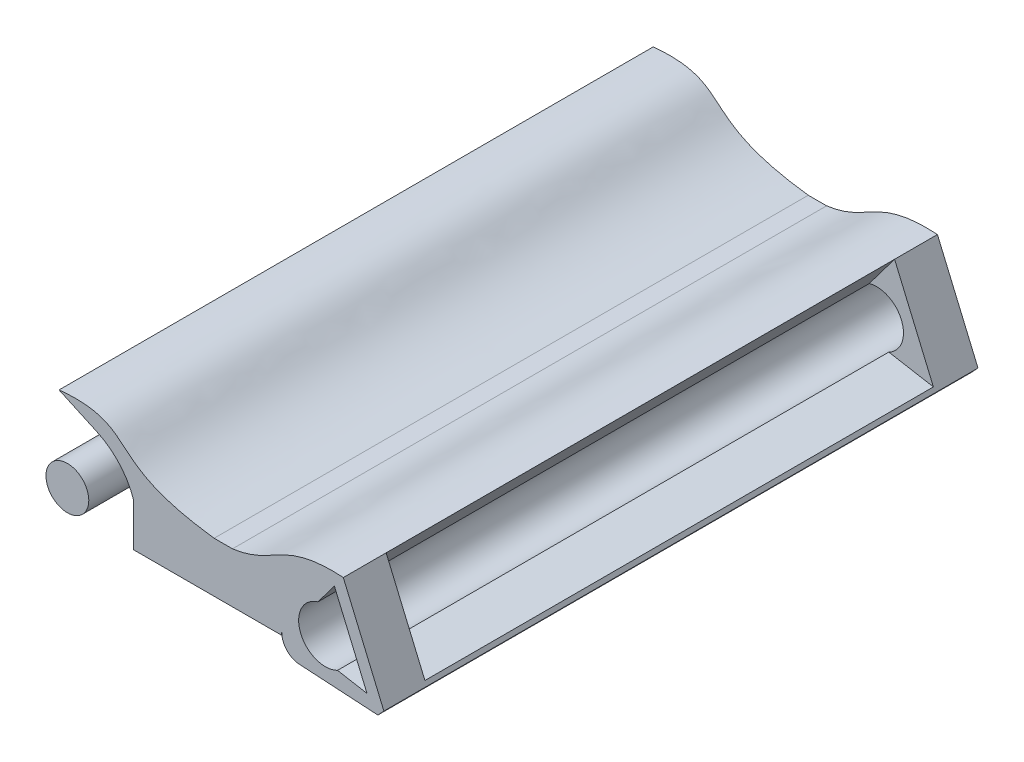
ISO-10303-21;
HEADER;
FILE_DESCRIPTION(('STEP AP214'),'2;1');
FILE_NAME('part.step','',(''),(''),'','','');
FILE_SCHEMA(('AUTOMOTIVE_DESIGN { 1 0 10303 214 1 1 1 1 }'));
ENDSEC;
DATA;
#1=APPLICATION_CONTEXT('core data for automotive mechanical design processes');
#2=APPLICATION_PROTOCOL_DEFINITION('international standard','automotive_design',2000,#1);
#3=PRODUCT_CONTEXT('',#1,'mechanical');
#4=PRODUCT('Part','Part','',(#3));
#5=PRODUCT_RELATED_PRODUCT_CATEGORY('part','',(#4));
#6=PRODUCT_DEFINITION_FORMATION('','',#4);
#7=PRODUCT_DEFINITION_CONTEXT('part definition',#1,'design');
#8=PRODUCT_DEFINITION('design','',#6,#7);
#9=PRODUCT_DEFINITION_SHAPE('','',#8);
#10=(LENGTH_UNIT() NAMED_UNIT(*) SI_UNIT(.MILLI.,.METRE.));
#11=(NAMED_UNIT(*) PLANE_ANGLE_UNIT() SI_UNIT($,.RADIAN.));
#12=(NAMED_UNIT(*) SI_UNIT($,.STERADIAN.) SOLID_ANGLE_UNIT());
#13=UNCERTAINTY_MEASURE_WITH_UNIT(LENGTH_MEASURE(1.E-05),#10,'distance_accuracy_value','');
#14=(GEOMETRIC_REPRESENTATION_CONTEXT(3) GLOBAL_UNCERTAINTY_ASSIGNED_CONTEXT((#13)) GLOBAL_UNIT_ASSIGNED_CONTEXT((#10,
#11,#12)) REPRESENTATION_CONTEXT('',''));
#15=CARTESIAN_POINT('',(0.,0.,0.));
#16=DIRECTION('',(0.,0.,1.));
#17=DIRECTION('',(1.,0.,0.));
#18=AXIS2_PLACEMENT_3D('',#15,#16,#17);
#19=CARTESIAN_POINT('',(0.,2.,49.89));
#20=DIRECTION('',(0.,1.,0.));
#21=DIRECTION('',(0.,0.,1.));
#22=AXIS2_PLACEMENT_3D('',#19,#20,#21);
#23=PLANE('',#22);
#24=DIRECTION('',(-1.,0.,0.));
#25=VECTOR('',#24,1.);
#26=CARTESIAN_POINT('',(0.,2.,49.99));
#27=LINE('',#26,#25);
#28=CARTESIAN_POINT('',(6.09107436430707,1.99992523995453,49.99));
#29=VERTEX_POINT('',#28);
#30=CARTESIAN_POINT('',(0.,2.,49.99));
#31=VERTEX_POINT('',#30);
#32=EDGE_CURVE('E264',#29,#31,#27,.T.);
#33=ORIENTED_EDGE('',*,*,#32,.F.);
#34=CARTESIAN_POINT('',(6.0910498178161,2.,49.99));
#35=DIRECTION('',(0.,0.,-1.));
#36=VECTOR('',#35,1.);
#37=LINE('',#34,#36);
#38=CARTESIAN_POINT('',(6.09130206674588,2.,49.89));
#39=VERTEX_POINT('',#38);
#40=EDGE_CURVE('E466',#29,#39,#37,.T.);
#41=ORIENTED_EDGE('',*,*,#40,.T.);
#42=CARTESIAN_POINT('',(6.09109891079803,1.99985047990906,5.50000000000001));
#43=DIRECTION('',(0.,0.,1.));
#44=VECTOR('',#43,1.);
#45=LINE('',#42,#44);
#46=CARTESIAN_POINT('',(6.09107436430707,1.99992523995453,5.50000000000001));
#47=VERTEX_POINT('',#46);
#48=EDGE_CURVE('E363',#47,#39,#45,.T.);
#49=ORIENTED_EDGE('',*,*,#48,.F.);
#50=DIRECTION('',(1.,0.,0.));
#51=VECTOR('',#50,1.);
#52=CARTESIAN_POINT('',(0.,2.,5.5));
#53=LINE('',#52,#51);
#54=CARTESIAN_POINT('',(0.,2.,5.5));
#55=VERTEX_POINT('',#54);
#56=EDGE_CURVE('E273',#55,#47,#53,.T.);
#57=ORIENTED_EDGE('',*,*,#56,.F.);
#58=DIRECTION('',(0.,0.,-1.));
#59=VECTOR('',#58,1.);
#60=CARTESIAN_POINT('',(0.,2.,49.89));
#61=LINE('',#60,#59);
#62=EDGE_CURVE('E52',#31,#55,#61,.T.);
#63=ORIENTED_EDGE('',*,*,#62,.F.);
#64=EDGE_LOOP('',(#33,#41,#49,#57,#63));
#65=FACE_BOUND('',#64,.T.);
#66=ADVANCED_FACE('F42',(#65),#23,.T.);
#67=CARTESIAN_POINT('',(0.,0.,0.));
#68=DIRECTION('',(0.,0.,1.));
#69=DIRECTION('',(1.,0.,0.));
#70=AXIS2_PLACEMENT_3D('',#67,#68,#69);
#71=PLANE('',#70);
#72=CARTESIAN_POINT('',(0.,0.,0.));
#73=DIRECTION('',(0.,0.,1.));
#74=DIRECTION('',(1.,0.,0.));
#75=AXIS2_PLACEMENT_3D('',#72,#73,#74);
#76=CIRCLE('',#75,2.);
#77=CARTESIAN_POINT('',(2.,0.,0.));
#78=VERTEX_POINT('',#77);
#79=EDGE_CURVE('E652',#78,#78,#76,.T.);
#80=ORIENTED_EDGE('',*,*,#79,.F.);
#81=EDGE_LOOP('',(#80));
#82=FACE_BOUND('',#81,.T.);
#83=ADVANCED_FACE('F443',(#82),#71,.F.);
#84=CARTESIAN_POINT('',(0.376392195235238,2.13462621388361,55.49));
#85=DIRECTION('',(0.17364817766693,0.984807753012208,0.));
#86=DIRECTION('',(-0.984807753012208,0.17364817766693,0.));
#87=AXIS2_PLACEMENT_3D('',#84,#85,#86);
#88=PLANE('',#87);
#89=DIRECTION('',(0.984807753012208,-0.17364817766693,0.));
#90=VECTOR('',#89,1.);
#91=CARTESIAN_POINT('',(0.376392195235238,2.13462621388361,4.));
#92=LINE('',#91,#90);
#93=CARTESIAN_POINT('',(25.1299152741845,-2.23008777252481,4.));
#94=VERTEX_POINT('',#93);
#95=CARTESIAN_POINT('',(29.2957308883209,-2.96463346195368,4.));
#96=VERTEX_POINT('',#95);
#97=EDGE_CURVE('E60',#94,#96,#92,.T.);
#98=ORIENTED_EDGE('',*,*,#97,.F.);
#99=DIRECTION('',(0.,0.,-1.));
#100=VECTOR('',#99,1.);
#101=CARTESIAN_POINT('',(25.1299152741845,-2.23008777252481,55.49));
#102=LINE('',#101,#100);
#103=CARTESIAN_POINT('',(25.1299152741845,-2.23008777252481,55.49));
#104=VERTEX_POINT('',#103);
#105=EDGE_CURVE('E720',#104,#94,#102,.T.);
#106=ORIENTED_EDGE('',*,*,#105,.F.);
#107=DIRECTION('',(0.984807753012208,-0.17364817766693,0.));
#108=VECTOR('',#107,1.);
#109=CARTESIAN_POINT('',(0.376392195235238,2.13462621388361,55.49));
#110=LINE('',#109,#108);
#111=CARTESIAN_POINT('',(27.8858576429487,-2.71603476941555,55.49));
#112=VERTEX_POINT('',#111);
#113=EDGE_CURVE('E695',#104,#112,#110,.T.);
#114=ORIENTED_EDGE('',*,*,#113,.T.);
#115=DIRECTION('',(0.,0.,1.));
#116=VECTOR('',#115,1.);
#117=CARTESIAN_POINT('',(27.8858576429487,-2.71603476941555,51.49));
#118=LINE('',#117,#116);
#119=CARTESIAN_POINT('',(27.8858576429487,-2.71603476941555,51.49));
#120=VERTEX_POINT('',#119);
#121=EDGE_CURVE('E537',#120,#112,#118,.T.);
#122=ORIENTED_EDGE('',*,*,#121,.F.);
#123=DIRECTION('',(-0.984807753012208,0.17364817766693,0.));
#124=VECTOR('',#123,1.);
#125=CARTESIAN_POINT('',(0.376392195235238,2.13462621388361,51.49));
#126=LINE('',#125,#124);
#127=CARTESIAN_POINT('',(29.2957308883209,-2.96463346195369,51.49));
#128=VERTEX_POINT('',#127);
#129=EDGE_CURVE('E541',#128,#120,#126,.T.);
#130=ORIENTED_EDGE('',*,*,#129,.F.);
#131=DIRECTION('',(0.,0.,-1.));
#132=VECTOR('',#131,1.);
#133=CARTESIAN_POINT('',(29.2957308883209,-2.96463346195368,55.49));
#134=LINE('',#133,#132);
#135=EDGE_CURVE('E723',#128,#96,#134,.T.);
#136=ORIENTED_EDGE('',*,*,#135,.T.);
#137=EDGE_LOOP('',(#98,#106,#114,#122,#130,#136));
#138=FACE_BOUND('',#137,.T.);
#139=ADVANCED_FACE('F463',(#138),#88,.T.);
#140=CARTESIAN_POINT('',(13.7288679724563,-10.3272499695584,55.49));
#141=DIRECTION('',(-0.799144241668146,0.601139319133796,0.));
#142=DIRECTION('',(-0.601139319133796,-0.799144241668146,0.));
#143=AXIS2_PLACEMENT_3D('',#140,#141,#142);
#144=PLANE('',#143);
#145=DIRECTION('',(0.,0.,-1.));
#146=VECTOR('',#145,1.);
#147=CARTESIAN_POINT('',(23.3034204953644,2.40099500076981,55.49));
#148=LINE('',#147,#146);
#149=CARTESIAN_POINT('',(23.3034204953644,2.40099500076981,55.49));
#150=VERTEX_POINT('',#149);
#151=CARTESIAN_POINT('',(23.3034204953644,2.40099500076981,4.));
#152=VERTEX_POINT('',#151);
#153=EDGE_CURVE('E717',#150,#152,#148,.T.);
#154=ORIENTED_EDGE('',*,*,#153,.T.);
#155=DIRECTION('',(0.601139319133796,0.799144241668146,0.));
#156=VECTOR('',#155,1.);
#157=CARTESIAN_POINT('',(13.7288679724563,-10.3272499695584,4.));
#158=LINE('',#157,#156);
#159=CARTESIAN_POINT('',(25.6726962678702,5.55066934456434,4.));
#160=VERTEX_POINT('',#159);
#161=EDGE_CURVE('E68',#152,#160,#158,.T.);
#162=ORIENTED_EDGE('',*,*,#161,.T.);
#163=DIRECTION('',(0.,0.,-1.));
#164=VECTOR('',#163,1.);
#165=CARTESIAN_POINT('',(25.6726962678702,5.55066934456434,55.49));
#166=LINE('',#165,#164);
#167=CARTESIAN_POINT('',(25.6726962678702,5.55066934456434,51.49));
#168=VERTEX_POINT('',#167);
#169=EDGE_CURVE('E407',#168,#160,#166,.T.);
#170=ORIENTED_EDGE('',*,*,#169,.F.);
#171=DIRECTION('',(-0.601139319133796,-0.799144241668146,0.));
#172=VECTOR('',#171,1.);
#173=CARTESIAN_POINT('',(13.7288679724563,-10.3272499695584,51.49));
#174=LINE('',#173,#172);
#175=CARTESIAN_POINT('',(24.8397331933365,4.44334260124807,51.49));
#176=VERTEX_POINT('',#175);
#177=EDGE_CURVE('E547',#168,#176,#174,.T.);
#178=ORIENTED_EDGE('',*,*,#177,.T.);
#179=DIRECTION('',(0.,0.,1.));
#180=VECTOR('',#179,1.);
#181=CARTESIAN_POINT('',(24.8397331933365,4.44334260124807,51.49));
#182=LINE('',#181,#180);
#183=CARTESIAN_POINT('',(24.8397331933365,4.44334260124807,55.49));
#184=VERTEX_POINT('',#183);
#185=EDGE_CURVE('E392',#176,#184,#182,.T.);
#186=ORIENTED_EDGE('',*,*,#185,.T.);
#187=DIRECTION('',(0.601139319133796,0.799144241668146,0.));
#188=VECTOR('',#187,1.);
#189=CARTESIAN_POINT('',(13.7288679724563,-10.3272499695584,55.49));
#190=LINE('',#189,#188);
#191=EDGE_CURVE('E679',#150,#184,#190,.T.);
#192=ORIENTED_EDGE('',*,*,#191,.F.);
#193=EDGE_LOOP('',(#154,#162,#170,#178,#186,#192));
#194=FACE_BOUND('',#193,.T.);
#195=ADVANCED_FACE('F442',(#194),#144,.F.);
#196=DIRECTION('',(-1.,0.,0.));
#197=VECTOR('',#196,1.);
#198=CARTESIAN_POINT('',(0.,-2.,0.));
#199=LINE('',#198,#197);
#200=CARTESIAN_POINT('',(19.9084830512739,-2.,0.));
#201=VERTEX_POINT('',#200);
#202=CARTESIAN_POINT('',(6.09130206674588,-2.,0.));
#203=VERTEX_POINT('',#202);
#204=EDGE_CURVE('E625',#201,#203,#199,.T.);
#205=ORIENTED_EDGE('',*,*,#204,.T.);
#206=DIRECTION('',(0.,-1.,0.));
#207=VECTOR('',#206,1.);
#208=CARTESIAN_POINT('',(6.09130206674588,0.,0.));
#209=LINE('',#208,#207);
#210=CARTESIAN_POINT('',(6.09130206674588,2.,0.));
#211=VERTEX_POINT('',#210);
#212=EDGE_CURVE('E239',#211,#203,#209,.T.);
#213=ORIENTED_EDGE('',*,*,#212,.F.);
#214=CARTESIAN_POINT('',(0.000126124464839075,-0.000288294002662691,0.));
#215=DIRECTION('',(0.,0.,1.));
#216=DIRECTION('',(1.,0.,0.));
#217=AXIS2_PLACEMENT_3D('',#214,#215,#216);
#218=CIRCLE('',#217,6.41120718889566);
#219=CARTESIAN_POINT('',(2.66521443689794,5.83073922315757,0.));
#220=VERTEX_POINT('',#219);
#221=EDGE_CURVE('E278',#220,#211,#218,.F.);
#222=ORIENTED_EDGE('',*,*,#221,.F.);
#223=DIRECTION('',(0.909490184402583,-0.4157253955141,0.));
#224=VECTOR('',#223,1.);
#225=CARTESIAN_POINT('',(2.66521443689794,5.83073922315757,0.));
#226=LINE('',#225,#224);
#227=CARTESIAN_POINT('',(-0.877126137495203,7.44993309857313,0.));
#228=VERTEX_POINT('',#227);
#229=EDGE_CURVE('E274',#228,#220,#226,.T.);
#230=ORIENTED_EDGE('',*,*,#229,.F.);
#231=CARTESIAN_POINT('',(13.6091499864008,2.69716019884859,0.));
#232=CARTESIAN_POINT('',(3.00893748679324,4.04391262787319,0.));
#233=CARTESIAN_POINT('',(6.6435499353925,7.42707390078312,0.));
#234=CARTESIAN_POINT('',(2.23172476193558,7.79282106542209,0.));
#235=CARTESIAN_POINT('',(-0.877126137495203,7.44993309857313,0.));
#236=B_SPLINE_CURVE_WITH_KNOTS('',4,(#231,#232,#233,#234,#235),.UNSPECIFIED.,.F.,.F.,(5,5),(0.,
1.),.UNSPECIFIED.);
#237=CARTESIAN_POINT('',(13.6091499864008,2.69716019884859,0.));
#238=VERTEX_POINT('',#237);
#239=EDGE_CURVE('E279',#238,#228,#236,.T.);
#240=ORIENTED_EDGE('',*,*,#239,.F.);
#241=DIRECTION('',(-1.,0.,0.));
#242=VECTOR('',#241,1.);
#243=CARTESIAN_POINT('',(0.,2.69716019884859,0.));
#244=LINE('',#243,#242);
#245=CARTESIAN_POINT('',(15.3226767719573,2.69716019884859,0.));
#246=VERTEX_POINT('',#245);
#247=EDGE_CURVE('E616',#246,#238,#244,.T.);
#248=ORIENTED_EDGE('',*,*,#247,.F.);
#249=CARTESIAN_POINT('',(15.3226767719573,2.69716019884859,0.));
#250=CARTESIAN_POINT('',(19.2593510513428,3.19828227357009,0.));
#251=CARTESIAN_POINT('',(19.8818146174948,5.92011733240757,0.));
#252=CARTESIAN_POINT('',(25.6726962678702,5.55066934456434,0.));
#253=B_SPLINE_CURVE_WITH_KNOTS('',3,(#249,#250,#251,#252),.UNSPECIFIED.,.F.,.F.,(4,4),(0.,1.),.UNSPECIFIED.);
#254=CARTESIAN_POINT('',(25.5490554700396,5.55813413696268,0.));
#255=VERTEX_POINT('',#254);
#256=EDGE_CURVE('E607',#255,#246,#253,.F.);
#257=ORIENTED_EDGE('',*,*,#256,.F.);
#258=CARTESIAN_POINT('',(25.6726962678702,5.55066934456434,0.));
#259=CARTESIAN_POINT('',(25.6312213648166,5.55331536988557,0.));
#260=CARTESIAN_POINT('',(25.5900115796428,5.55580282552572,0.));
#261=CARTESIAN_POINT('',(25.5490637959536,5.55813366303538,0.));
#262=B_SPLINE_CURVE_WITH_KNOTS('',3,(#258,#259,#260,#261),.UNSPECIFIED.,.F.,.F.,(4,4),
(0.992837894891027,1.),.UNSPECIFIED.);
#263=CARTESIAN_POINT('',(25.6726962678702,5.55066934456434,0.));
#264=VERTEX_POINT('',#263);
#265=EDGE_CURVE('E424',#264,#255,#262,.T.);
#266=ORIENTED_EDGE('',*,*,#265,.F.);
#267=DIRECTION('',(0.391509555005763,-0.920174042417623,0.));
#268=VECTOR('',#267,1.);
#269=CARTESIAN_POINT('',(23.7372593697443,10.0995718467433,0.));
#270=LINE('',#269,#268);
#271=CARTESIAN_POINT('',(29.4627825578501,-3.35725889874783,0.));
#272=VERTEX_POINT('',#271);
#273=EDGE_CURVE('E400',#264,#272,#270,.T.);
#274=ORIENTED_EDGE('',*,*,#273,.T.);
#275=DIRECTION('',(-0.681981729193069,-0.731369209802293,0.));
#276=VECTOR('',#275,1.);
#277=CARTESIAN_POINT('',(17.4342045920676,-16.2569176217004,0.));
#278=LINE('',#277,#276);
#279=CARTESIAN_POINT('',(28.8989104366643,-3.96196528610093,0.));
#280=VERTEX_POINT('',#279);
#281=EDGE_CURVE('E404',#272,#280,#278,.T.);
#282=ORIENTED_EDGE('',*,*,#281,.T.);
#283=DIRECTION('',(0.998182407331373,-0.0602650951558613,0.));
#284=VECTOR('',#283,1.);
#285=CARTESIAN_POINT('',(-0.133376807818402,-2.20914582091053,0.));
#286=LINE('',#285,#284);
#287=CARTESIAN_POINT('',(21.5699313166548,-3.51947940294103,0.));
#288=VERTEX_POINT('',#287);
#289=EDGE_CURVE('E707',#288,#280,#286,.T.);
#290=ORIENTED_EDGE('',*,*,#289,.F.);
#291=CARTESIAN_POINT('',(21.6753952331775,-1.77266019011113,0.));
#292=DIRECTION('',(0.,0.,1.));
#293=DIRECTION('',(1.,0.,0.));
#294=AXIS2_PLACEMENT_3D('',#291,#292,#293);
#295=CIRCLE('',#294,1.75);
#296=CARTESIAN_POINT('',(19.9285760203476,-1.66719627358837,0.));
#297=VERTEX_POINT('',#296);
#298=EDGE_CURVE('E703',#288,#297,#295,.F.);
#299=ORIENTED_EDGE('',*,*,#298,.T.);
#300=DIRECTION('',(0.0602650951558623,0.998182407331373,0.));
#301=VECTOR('',#300,1.);
#302=CARTESIAN_POINT('',(19.9564889116432,-1.20486966550777,0.));
#303=LINE('',#302,#301);
#304=EDGE_CURVE('E595',#201,#297,#303,.T.);
#305=ORIENTED_EDGE('',*,*,#304,.F.);
#306=EDGE_LOOP('',(#205,#213,#222,#230,#240,#248,#257,#266,#274,#282,#290,#299,#305));
#307=FACE_BOUND('',#306,.T.);
#308=CARTESIAN_POINT('',(24.,0.,0.));
#309=DIRECTION('',(0.,0.,1.));
#310=DIRECTION('',(1.,0.,0.));
#311=AXIS2_PLACEMENT_3D('',#308,#309,#310);
#312=CIRCLE('',#311,2.5);
#313=CARTESIAN_POINT('',(26.5,0.,0.));
#314=VERTEX_POINT('',#313);
#315=EDGE_CURVE('E403',#314,#314,#312,.T.);
#316=ORIENTED_EDGE('',*,*,#315,.T.);
#317=EDGE_LOOP('',(#316));
#318=FACE_BOUND('',#317,.T.);
#319=ADVANCED_FACE('F431',(#307,#318),#71,.F.);
#320=CARTESIAN_POINT('',(0.,0.,55.49));
#321=DIRECTION('',(0.,0.,1.));
#322=DIRECTION('',(1.,0.,0.));
#323=AXIS2_PLACEMENT_3D('',#320,#321,#322);
#324=PLANE('',#323);
#325=DIRECTION('',(0.,1.,0.));
#326=VECTOR('',#325,1.);
#327=CARTESIAN_POINT('',(6.09130206674588,0.,55.49));
#328=LINE('',#327,#326);
#329=CARTESIAN_POINT('',(6.09130206674588,-2.,55.49));
#330=VERTEX_POINT('',#329);
#331=CARTESIAN_POINT('',(6.09113930397736,1.99983901627577,55.49));
#332=VERTEX_POINT('',#331);
#333=EDGE_CURVE('E232',#330,#332,#328,.T.);
#334=ORIENTED_EDGE('',*,*,#333,.F.);
#335=DIRECTION('',(1.,0.,0.));
#336=VECTOR('',#335,1.);
#337=CARTESIAN_POINT('',(0.,-2.,55.49));
#338=LINE('',#337,#336);
#339=CARTESIAN_POINT('',(19.9084830512739,-2.,55.49));
#340=VERTEX_POINT('',#339);
#341=EDGE_CURVE('E237',#330,#340,#338,.T.);
#342=ORIENTED_EDGE('',*,*,#341,.T.);
#343=DIRECTION('',(-0.0602650951558623,-0.998182407331373,0.));
#344=VECTOR('',#343,1.);
#345=CARTESIAN_POINT('',(19.9564889116432,-1.20486966550777,55.49));
#346=LINE('',#345,#344);
#347=CARTESIAN_POINT('',(19.9285760203476,-1.66719627358835,55.49));
#348=VERTEX_POINT('',#347);
#349=EDGE_CURVE('E350',#348,#340,#346,.T.);
#350=ORIENTED_EDGE('',*,*,#349,.F.);
#351=CARTESIAN_POINT('',(21.6753952331775,-1.77266019011113,55.49));
#352=DIRECTION('',(0.,0.,1.));
#353=DIRECTION('',(1.,0.,0.));
#354=AXIS2_PLACEMENT_3D('',#351,#352,#353);
#355=CIRCLE('',#354,1.75);
#356=CARTESIAN_POINT('',(21.5699313166548,-3.51947940294103,55.49));
#357=VERTEX_POINT('',#356);
#358=EDGE_CURVE('E649',#357,#348,#355,.F.);
#359=ORIENTED_EDGE('',*,*,#358,.F.);
#360=DIRECTION('',(0.998182407331373,-0.0602650951558613,0.));
#361=VECTOR('',#360,1.);
#362=CARTESIAN_POINT('',(-0.133376807818402,-2.20914582091053,55.49));
#363=LINE('',#362,#361);
#364=CARTESIAN_POINT('',(28.8989104366643,-3.96196528610093,55.49));
#365=VERTEX_POINT('',#364);
#366=EDGE_CURVE('E748',#357,#365,#363,.T.);
#367=ORIENTED_EDGE('',*,*,#366,.T.);
#368=DIRECTION('',(-0.681981729193069,-0.731369209802293,0.));
#369=VECTOR('',#368,1.);
#370=CARTESIAN_POINT('',(17.4342045920676,-16.2569176217004,55.49));
#371=LINE('',#370,#369);
#372=CARTESIAN_POINT('',(29.4627825578501,-3.35725889874783,55.49));
#373=VERTEX_POINT('',#372);
#374=EDGE_CURVE('E736',#373,#365,#371,.T.);
#375=ORIENTED_EDGE('',*,*,#374,.F.);
#376=DIRECTION('',(0.391509555005763,-0.920174042417623,0.));
#377=VECTOR('',#376,1.);
#378=CARTESIAN_POINT('',(23.7372593697443,10.0995718467433,55.49));
#379=LINE('',#378,#377);
#380=CARTESIAN_POINT('',(25.6726962678702,5.55066934456434,55.49));
#381=VERTEX_POINT('',#380);
#382=EDGE_CURVE('E699',#381,#373,#379,.T.);
#383=ORIENTED_EDGE('',*,*,#382,.F.);
#384=CARTESIAN_POINT('',(25.5490637959536,5.55813366303538,55.49));
#385=CARTESIAN_POINT('',(25.5900115796428,5.55580282552572,55.49));
#386=CARTESIAN_POINT('',(25.6312213648166,5.55331536988557,55.49));
#387=CARTESIAN_POINT('',(25.6726962678702,5.55066934456434,55.49));
#388=B_SPLINE_CURVE_WITH_KNOTS('',3,(#384,#385,#386,#387),.UNSPECIFIED.,.F.,.F.,(4,4),
(0.992837894891027,1.),.UNSPECIFIED.);
#389=CARTESIAN_POINT('',(25.5490637959031,5.55813366303825,55.49));
#390=VERTEX_POINT('',#389);
#391=EDGE_CURVE('E412',#381,#390,#388,.F.);
#392=ORIENTED_EDGE('',*,*,#391,.T.);
#393=CARTESIAN_POINT('',(15.3226767719573,2.69716019884859,55.49));
#394=CARTESIAN_POINT('',(19.2593510513428,3.19828227357009,55.49));
#395=CARTESIAN_POINT('',(19.8818146174948,5.92011733240757,55.49));
#396=CARTESIAN_POINT('',(25.6726962678702,5.55066934456434,55.49));
#397=B_SPLINE_CURVE_WITH_KNOTS('',3,(#393,#394,#395,#396),.UNSPECIFIED.,.F.,.F.,(4,4),(0.,1.),.UNSPECIFIED.);
#398=CARTESIAN_POINT('',(15.3226767719573,2.69716019884859,55.49));
#399=VERTEX_POINT('',#398);
#400=EDGE_CURVE('E429',#399,#390,#397,.T.);
#401=ORIENTED_EDGE('',*,*,#400,.F.);
#402=DIRECTION('',(1.,0.,0.));
#403=VECTOR('',#402,1.);
#404=CARTESIAN_POINT('',(0.,2.69716019884859,55.49));
#405=LINE('',#404,#403);
#406=CARTESIAN_POINT('',(13.6091499864008,2.69716019884859,55.49));
#407=VERTEX_POINT('',#406);
#408=EDGE_CURVE('E633',#407,#399,#405,.T.);
#409=ORIENTED_EDGE('',*,*,#408,.F.);
#410=CARTESIAN_POINT('',(13.6091499864008,2.69716019884859,55.49));
#411=CARTESIAN_POINT('',(3.00893748679324,4.04391262787319,55.49));
#412=CARTESIAN_POINT('',(6.6435499353925,7.42707390078312,55.49));
#413=CARTESIAN_POINT('',(2.23172476193558,7.79282106542209,55.49));
#414=CARTESIAN_POINT('',(-0.877126137495203,7.44993309857313,55.49));
#415=B_SPLINE_CURVE_WITH_KNOTS('',4,(#410,#411,#412,#413,#414),.UNSPECIFIED.,.F.,.F.,(5,5),(0.,
1.),.UNSPECIFIED.);
#416=CARTESIAN_POINT('',(-0.877126137495203,7.44993309857313,55.49));
#417=VERTEX_POINT('',#416);
#418=EDGE_CURVE('E503',#407,#417,#415,.T.);
#419=ORIENTED_EDGE('',*,*,#418,.T.);
#420=DIRECTION('',(0.909490184402584,-0.415725395514098,0.));
#421=VECTOR('',#420,1.);
#422=CARTESIAN_POINT('',(2.66521443689795,5.83073922315758,55.49));
#423=LINE('',#422,#421);
#424=CARTESIAN_POINT('',(2.66521443689795,5.83073922315758,55.49));
#425=VERTEX_POINT('',#424);
#426=EDGE_CURVE('E564',#417,#425,#423,.T.);
#427=ORIENTED_EDGE('',*,*,#426,.T.);
#428=CARTESIAN_POINT('',(0.,0.,55.49));
#429=DIRECTION('',(0.,0.,1.));
#430=DIRECTION('',(1.,0.,0.));
#431=AXIS2_PLACEMENT_3D('',#428,#429,#430);
#432=CIRCLE('',#431,6.41099741718225);
#433=EDGE_CURVE('E504',#332,#425,#432,.T.);
#434=ORIENTED_EDGE('',*,*,#433,.F.);
#435=EDGE_LOOP('',(#334,#342,#350,#359,#367,#375,#383,#392,#401,#409,#419,#427,#434));
#436=FACE_BOUND('',#435,.T.);
#437=ORIENTED_EDGE('',*,*,#191,.T.);
#438=DIRECTION('',(-0.391509555005764,0.920174042417623,0.));
#439=VECTOR('',#438,1.);
#440=CARTESIAN_POINT('',(22.6330505188432,9.62976038073638,55.49));
#441=LINE('',#440,#439);
#442=EDGE_CURVE('E283',#112,#184,#441,.T.);
#443=ORIENTED_EDGE('',*,*,#442,.F.);
#444=ORIENTED_EDGE('',*,*,#113,.F.);
#445=CARTESIAN_POINT('',(24.,0.,55.49));
#446=DIRECTION('',(0.,0.,1.));
#447=DIRECTION('',(1.,0.,0.));
#448=AXIS2_PLACEMENT_3D('',#445,#446,#447);
#449=CIRCLE('',#448,2.5);
#450=EDGE_CURVE('E687',#150,#104,#449,.T.);
#451=ORIENTED_EDGE('',*,*,#450,.F.);
#452=EDGE_LOOP('',(#437,#443,#444,#451));
#453=FACE_BOUND('',#452,.T.);
#454=ADVANCED_FACE('F441',(#436,#453),#324,.T.);
#455=CARTESIAN_POINT('',(0.,0.,49.89));
#456=DIRECTION('',(0.,0.,-1.));
#457=DIRECTION('',(-1.,0.,0.));
#458=AXIS2_PLACEMENT_3D('',#455,#456,#457);
#459=CYLINDRICAL_SURFACE('',#458,2.);
#460=CARTESIAN_POINT('',(0.,0.,49.99));
#461=DIRECTION('',(0.,0.,1.));
#462=DIRECTION('',(1.,0.,0.));
#463=AXIS2_PLACEMENT_3D('',#460,#461,#462);
#464=CIRCLE('',#463,2.);
#465=CARTESIAN_POINT('',(0.,-2.,49.99));
#466=VERTEX_POINT('',#465);
#467=EDGE_CURVE('E216',#466,#31,#464,.T.);
#468=ORIENTED_EDGE('',*,*,#467,.T.);
#469=ORIENTED_EDGE('',*,*,#62,.T.);
#470=CARTESIAN_POINT('',(0.,0.,5.5));
#471=DIRECTION('',(0.,0.,1.));
#472=DIRECTION('',(1.,0.,0.));
#473=AXIS2_PLACEMENT_3D('',#470,#471,#472);
#474=CIRCLE('',#473,2.);
#475=CARTESIAN_POINT('',(0.,-2.,5.5));
#476=VERTEX_POINT('',#475);
#477=EDGE_CURVE('E221',#476,#55,#474,.T.);
#478=ORIENTED_EDGE('',*,*,#477,.F.);
#479=DIRECTION('',(0.,0.,-1.));
#480=VECTOR('',#479,1.);
#481=CARTESIAN_POINT('',(0.,-2.,49.89));
#482=LINE('',#481,#480);
#483=EDGE_CURVE('E666',#466,#476,#482,.T.);
#484=ORIENTED_EDGE('',*,*,#483,.F.);
#485=EDGE_LOOP('',(#468,#469,#478,#484));
#486=FACE_BOUND('',#485,.T.);
#487=ORIENTED_EDGE('',*,*,#79,.T.);
#488=EDGE_LOOP('',(#487));
#489=FACE_BOUND('',#488,.T.);
#490=CARTESIAN_POINT('',(0.,0.,55.59));
#491=DIRECTION('',(0.,0.,1.));
#492=DIRECTION('',(1.,0.,0.));
#493=AXIS2_PLACEMENT_3D('',#490,#491,#492);
#494=CIRCLE('',#493,2.);
#495=CARTESIAN_POINT('',(2.,0.,55.59));
#496=VERTEX_POINT('',#495);
#497=EDGE_CURVE('E658',#496,#496,#494,.T.);
#498=ORIENTED_EDGE('',*,*,#497,.F.);
#499=EDGE_LOOP('',(#498));
#500=FACE_BOUND('',#499,.T.);
#501=ADVANCED_FACE('F447',(#486,#489,#500),#459,.T.);
#502=CARTESIAN_POINT('',(0.,-2.,49.89));
#503=DIRECTION('',(0.,1.,0.));
#504=DIRECTION('',(0.,0.,1.));
#505=AXIS2_PLACEMENT_3D('',#502,#503,#504);
#506=PLANE('',#505);
#507=ORIENTED_EDGE('',*,*,#341,.F.);
#508=DIRECTION('',(0.,0.,1.));
#509=VECTOR('',#508,1.);
#510=CARTESIAN_POINT('',(6.09130206674588,-2.,49.99));
#511=LINE('',#510,#509);
#512=CARTESIAN_POINT('',(6.09130206674588,-2.,49.99));
#513=VERTEX_POINT('',#512);
#514=EDGE_CURVE('E226',#513,#330,#511,.T.);
#515=ORIENTED_EDGE('',*,*,#514,.F.);
#516=DIRECTION('',(-1.,0.,0.));
#517=VECTOR('',#516,1.);
#518=CARTESIAN_POINT('',(0.,-2.,49.99));
#519=LINE('',#518,#517);
#520=EDGE_CURVE('E210',#513,#466,#519,.T.);
#521=ORIENTED_EDGE('',*,*,#520,.T.);
#522=ORIENTED_EDGE('',*,*,#483,.T.);
#523=DIRECTION('',(1.,0.,0.));
#524=VECTOR('',#523,1.);
#525=CARTESIAN_POINT('',(0.,-2.,5.5));
#526=LINE('',#525,#524);
#527=CARTESIAN_POINT('',(6.09130206674588,-2.,5.5));
#528=VERTEX_POINT('',#527);
#529=EDGE_CURVE('E270',#476,#528,#526,.T.);
#530=ORIENTED_EDGE('',*,*,#529,.T.);
#531=DIRECTION('',(0.,0.,-1.));
#532=VECTOR('',#531,1.);
#533=CARTESIAN_POINT('',(6.09130206674588,-2.,5.5));
#534=LINE('',#533,#532);
#535=EDGE_CURVE('E251',#528,#203,#534,.T.);
#536=ORIENTED_EDGE('',*,*,#535,.T.);
#537=ORIENTED_EDGE('',*,*,#204,.F.);
#538=DIRECTION('',(0.,0.,-1.));
#539=VECTOR('',#538,1.);
#540=CARTESIAN_POINT('',(19.9084830512739,-2.,49.89));
#541=LINE('',#540,#539);
#542=EDGE_CURVE('E644',#340,#201,#541,.T.);
#543=ORIENTED_EDGE('',*,*,#542,.F.);
#544=EDGE_LOOP('',(#507,#515,#521,#522,#530,#536,#537,#543));
#545=FACE_BOUND('',#544,.T.);
#546=ADVANCED_FACE('F235',(#545),#506,.F.);
#547=CARTESIAN_POINT('',(0.,0.,55.59));
#548=DIRECTION('',(0.,0.,1.));
#549=DIRECTION('',(1.,0.,0.));
#550=AXIS2_PLACEMENT_3D('',#547,#548,#549);
#551=PLANE('',#550);
#552=ORIENTED_EDGE('',*,*,#497,.T.);
#553=EDGE_LOOP('',(#552));
#554=FACE_BOUND('',#553,.T.);
#555=ADVANCED_FACE('F444',(#554),#551,.T.);
#556=CARTESIAN_POINT('',(19.9564889116432,-1.20486966550777,55.49));
#557=DIRECTION('',(0.998182407331373,-0.0602650951558623,0.));
#558=DIRECTION('',(0.0602650951558623,0.998182407331373,0.));
#559=AXIS2_PLACEMENT_3D('',#556,#557,#558);
#560=PLANE('',#559);
#561=ORIENTED_EDGE('',*,*,#542,.T.);
#562=ORIENTED_EDGE('',*,*,#304,.T.);
#563=DIRECTION('',(0.,0.,-1.));
#564=VECTOR('',#563,1.);
#565=CARTESIAN_POINT('',(19.9285760203476,-1.66719627358837,55.49));
#566=LINE('',#565,#564);
#567=EDGE_CURVE('E11',#348,#297,#566,.T.);
#568=ORIENTED_EDGE('',*,*,#567,.F.);
#569=ORIENTED_EDGE('',*,*,#349,.T.);
#570=EDGE_LOOP('',(#561,#562,#568,#569));
#571=FACE_BOUND('',#570,.T.);
#572=ADVANCED_FACE('F642',(#571),#560,.T.);
#573=CARTESIAN_POINT('',(21.6753952331775,-1.77266019011113,55.49));
#574=DIRECTION('',(0.,0.,-1.));
#575=DIRECTION('',(-1.,0.,0.));
#576=AXIS2_PLACEMENT_3D('',#573,#574,#575);
#577=CYLINDRICAL_SURFACE('',#576,1.75);
#578=ORIENTED_EDGE('',*,*,#298,.F.);
#579=DIRECTION('',(0.,0.,-1.));
#580=VECTOR('',#579,1.);
#581=CARTESIAN_POINT('',(21.5699313166548,-3.51947940294103,55.49));
#582=LINE('',#581,#580);
#583=EDGE_CURVE('E653',#357,#288,#582,.T.);
#584=ORIENTED_EDGE('',*,*,#583,.F.);
#585=ORIENTED_EDGE('',*,*,#358,.T.);
#586=ORIENTED_EDGE('',*,*,#567,.T.);
#587=EDGE_LOOP('',(#578,#584,#585,#586));
#588=FACE_BOUND('',#587,.T.);
#589=ADVANCED_FACE('F909',(#588),#577,.T.);
#590=CARTESIAN_POINT('',(-0.133376807818402,-2.20914582091053,55.49));
#591=DIRECTION('',(0.0602650951558612,0.998182407331373,0.));
#592=DIRECTION('',(-0.998182407331373,0.0602650951558613,0.));
#593=AXIS2_PLACEMENT_3D('',#590,#591,#592);
#594=PLANE('',#593);
#595=ORIENTED_EDGE('',*,*,#289,.T.);
#596=DIRECTION('',(0.,0.,-1.));
#597=VECTOR('',#596,1.);
#598=CARTESIAN_POINT('',(28.8989104366643,-3.96196528610093,55.49));
#599=LINE('',#598,#597);
#600=EDGE_CURVE('E660',#365,#280,#599,.T.);
#601=ORIENTED_EDGE('',*,*,#600,.F.);
#602=ORIENTED_EDGE('',*,*,#366,.F.);
#603=ORIENTED_EDGE('',*,*,#583,.T.);
#604=EDGE_LOOP('',(#595,#601,#602,#603));
#605=FACE_BOUND('',#604,.T.);
#606=ADVANCED_FACE('F740',(#605),#594,.F.);
#607=CARTESIAN_POINT('',(17.4342045920676,-16.2569176217004,55.49));
#608=DIRECTION('',(0.731369209802293,-0.681981729193069,0.));
#609=DIRECTION('',(0.681981729193069,0.731369209802293,0.));
#610=AXIS2_PLACEMENT_3D('',#607,#608,#609);
#611=PLANE('',#610);
#612=ORIENTED_EDGE('',*,*,#281,.F.);
#613=DIRECTION('',(0.,0.,-1.));
#614=VECTOR('',#613,1.);
#615=CARTESIAN_POINT('',(29.4627825578501,-3.35725889874783,55.49));
#616=LINE('',#615,#614);
#617=EDGE_CURVE('E726',#373,#272,#616,.T.);
#618=ORIENTED_EDGE('',*,*,#617,.F.);
#619=ORIENTED_EDGE('',*,*,#374,.T.);
#620=ORIENTED_EDGE('',*,*,#600,.T.);
#621=EDGE_LOOP('',(#612,#618,#619,#620));
#622=FACE_BOUND('',#621,.T.);
#623=ADVANCED_FACE('F734',(#622),#611,.T.);
#624=CARTESIAN_POINT('',(23.7372593697443,10.0995718467433,55.49));
#625=DIRECTION('',(0.920174042417623,0.391509555005763,0.));
#626=DIRECTION('',(-0.391509555005763,0.920174042417623,0.));
#627=AXIS2_PLACEMENT_3D('',#624,#625,#626);
#628=PLANE('',#627);
#629=DIRECTION('',(0.391509555005763,-0.920174042417623,0.));
#630=VECTOR('',#629,1.);
#631=CARTESIAN_POINT('',(23.7372593697443,10.0995718467433,4.));
#632=LINE('',#631,#630);
#633=EDGE_CURVE('E387',#160,#96,#632,.T.);
#634=ORIENTED_EDGE('',*,*,#633,.T.);
#635=ORIENTED_EDGE('',*,*,#135,.F.);
#636=DIRECTION('',(-0.391509555005763,0.920174042417623,0.));
#637=VECTOR('',#636,1.);
#638=CARTESIAN_POINT('',(23.7372593697443,10.0995718467433,51.49));
#639=LINE('',#638,#637);
#640=EDGE_CURVE('E413',#128,#168,#639,.T.);
#641=ORIENTED_EDGE('',*,*,#640,.T.);
#642=EDGE_CURVE('E411',#381,#168,#166,.T.);
#643=ORIENTED_EDGE('',*,*,#642,.F.);
#644=ORIENTED_EDGE('',*,*,#382,.T.);
#645=ORIENTED_EDGE('',*,*,#617,.T.);
#646=ORIENTED_EDGE('',*,*,#273,.F.);
#647=DIRECTION('',(0.,0.,-1.));
#648=VECTOR('',#647,1.);
#649=CARTESIAN_POINT('',(25.6726962678702,5.55066934456434,4.));
#650=LINE('',#649,#648);
#651=EDGE_CURVE('E378',#160,#264,#650,.T.);
#652=ORIENTED_EDGE('',*,*,#651,.F.);
#653=EDGE_LOOP('',(#634,#635,#641,#643,#644,#645,#646,#652));
#654=FACE_BOUND('',#653,.T.);
#655=ADVANCED_FACE('F746',(#654),#628,.T.);
#656=CARTESIAN_POINT('',(24.,0.,55.49));
#657=DIRECTION('',(0.,0.,-1.));
#658=DIRECTION('',(-1.,0.,0.));
#659=AXIS2_PLACEMENT_3D('',#656,#657,#658);
#660=CYLINDRICAL_SURFACE('',#659,2.5);
#661=ORIENTED_EDGE('',*,*,#315,.F.);
#662=EDGE_LOOP('',(#661));
#663=FACE_BOUND('',#662,.T.);
#664=ORIENTED_EDGE('',*,*,#105,.T.);
#665=CARTESIAN_POINT('',(24.,0.,4.));
#666=DIRECTION('',(0.,0.,1.));
#667=DIRECTION('',(1.,0.,0.));
#668=AXIS2_PLACEMENT_3D('',#665,#666,#667);
#669=CIRCLE('',#668,2.5);
#670=EDGE_CURVE('E255',#94,#152,#669,.T.);
#671=ORIENTED_EDGE('',*,*,#670,.T.);
#672=ORIENTED_EDGE('',*,*,#153,.F.);
#673=ORIENTED_EDGE('',*,*,#450,.T.);
#674=EDGE_LOOP('',(#664,#671,#672,#673));
#675=FACE_BOUND('',#674,.T.);
#676=ADVANCED_FACE('F580',(#663,#675),#660,.F.);
#677=CARTESIAN_POINT('',(0.,2.69716019884859,-26.8127515142219));
#678=DIRECTION('',(0.,-1.,0.));
#679=DIRECTION('',(0.,0.,-1.));
#680=AXIS2_PLACEMENT_3D('',#677,#678,#679);
#681=PLANE('',#680);
#682=DIRECTION('',(0.,0.,1.));
#683=VECTOR('',#682,1.);
#684=CARTESIAN_POINT('',(15.3226767719573,2.69716019884859,-26.8127515142219));
#685=LINE('',#684,#683);
#686=EDGE_CURVE('E602',#246,#399,#685,.T.);
#687=ORIENTED_EDGE('',*,*,#686,.F.);
#688=ORIENTED_EDGE('',*,*,#247,.T.);
#689=DIRECTION('',(0.,0.,1.));
#690=VECTOR('',#689,1.);
#691=CARTESIAN_POINT('',(13.6091499864008,2.69716019884859,-26.8127515142219));
#692=LINE('',#691,#690);
#693=EDGE_CURVE('E604',#238,#407,#692,.T.);
#694=ORIENTED_EDGE('',*,*,#693,.T.);
#695=ORIENTED_EDGE('',*,*,#408,.T.);
#696=EDGE_LOOP('',(#687,#688,#694,#695));
#697=FACE_BOUND('',#696,.T.);
#698=ADVANCED_FACE('F577',(#697),#681,.F.);
#699=CARTESIAN_POINT('',(15.3226767719573,2.69716019884859,-26.8127515142219));
#700=CARTESIAN_POINT('',(19.2593510513428,3.19828227357009,-26.8127515142219));
#701=CARTESIAN_POINT('',(19.8818146174948,5.92011733240757,-26.8127515142219));
#702=CARTESIAN_POINT('',(25.6726962678702,5.55066934456434,-26.8127515142219));
#703=B_SPLINE_CURVE_WITH_KNOTS('',3,(#699,#700,#701,#702),.UNSPECIFIED.,.F.,.F.,(4,4),(0.,1.),.UNSPECIFIED.);
#704=DIRECTION('',(0.,0.,1.));
#705=VECTOR('',#704,1.);
#706=SURFACE_OF_LINEAR_EXTRUSION('',#703,#705);
#707=ORIENTED_EDGE('',*,*,#265,.T.);
#708=ORIENTED_EDGE('',*,*,#256,.T.);
#709=ORIENTED_EDGE('',*,*,#686,.T.);
#710=ORIENTED_EDGE('',*,*,#400,.T.);
#711=ORIENTED_EDGE('',*,*,#391,.F.);
#712=ORIENTED_EDGE('',*,*,#642,.T.);
#713=ORIENTED_EDGE('',*,*,#169,.T.);
#714=ORIENTED_EDGE('',*,*,#651,.T.);
#715=EDGE_LOOP('',(#707,#708,#709,#710,#711,#712,#713,#714));
#716=FACE_BOUND('',#715,.T.);
#717=ADVANCED_FACE('F575',(#716),#706,.F.);
#718=CARTESIAN_POINT('',(13.6091499864008,2.69716019884859,78.6138019590983));
#719=CARTESIAN_POINT('',(3.00893748679324,4.04391262787319,78.6138019590983));
#720=CARTESIAN_POINT('',(6.6435499353925,7.42707390078312,78.6138019590983));
#721=CARTESIAN_POINT('',(2.23172476193558,7.79282106542209,78.6138019590983));
#722=CARTESIAN_POINT('',(-0.877126137495203,7.44993309857313,78.6138019590983));
#723=B_SPLINE_CURVE_WITH_KNOTS('',4,(#718,#719,#720,#721,#722),.UNSPECIFIED.,.F.,.F.,(5,5),(0.,
1.),.UNSPECIFIED.);
#724=DIRECTION('',(0.,0.,-1.));
#725=VECTOR('',#724,1.);
#726=SURFACE_OF_LINEAR_EXTRUSION('',#723,#725);
#727=ORIENTED_EDGE('',*,*,#418,.F.);
#728=ORIENTED_EDGE('',*,*,#693,.F.);
#729=ORIENTED_EDGE('',*,*,#239,.T.);
#730=DIRECTION('',(0.,0.,-1.));
#731=VECTOR('',#730,1.);
#732=CARTESIAN_POINT('',(-0.877126137495203,7.44993309857313,78.6138019590983));
#733=LINE('',#732,#731);
#734=EDGE_CURVE('E509',#417,#228,#733,.T.);
#735=ORIENTED_EDGE('',*,*,#734,.F.);
#736=EDGE_LOOP('',(#727,#728,#729,#735));
#737=FACE_BOUND('',#736,.T.);
#738=ADVANCED_FACE('F572',(#737),#726,.F.);
#739=CARTESIAN_POINT('',(2.66521443689795,5.83073922315758,78.6138019590983));
#740=DIRECTION('',(0.415725395514098,0.909490184402584,0.));
#741=DIRECTION('',(-0.909490184402584,0.415725395514098,0.));
#742=AXIS2_PLACEMENT_3D('',#739,#740,#741);
#743=PLANE('',#742);
#744=ORIENTED_EDGE('',*,*,#426,.F.);
#745=ORIENTED_EDGE('',*,*,#734,.T.);
#746=ORIENTED_EDGE('',*,*,#229,.T.);
#747=DIRECTION('',(0.,0.,1.));
#748=VECTOR('',#747,1.);
#749=CARTESIAN_POINT('',(2.66521443689794,5.83073922315757,-15.5387282695775));
#750=LINE('',#749,#748);
#751=CARTESIAN_POINT('',(2.66521443689794,5.83073922315757,0.300000000000002));
#752=VERTEX_POINT('',#751);
#753=EDGE_CURVE('E557',#220,#752,#750,.T.);
#754=ORIENTED_EDGE('',*,*,#753,.T.);
#755=DIRECTION('',(0.,0.,-1.));
#756=VECTOR('',#755,1.);
#757=CARTESIAN_POINT('',(2.66521443689795,5.83073922315758,78.6138019590983));
#758=LINE('',#757,#756);
#759=EDGE_CURVE('E500',#425,#752,#758,.T.);
#760=ORIENTED_EDGE('',*,*,#759,.F.);
#761=EDGE_LOOP('',(#744,#745,#746,#754,#760));
#762=FACE_BOUND('',#761,.T.);
#763=ADVANCED_FACE('F332',(#762),#743,.F.);
#764=CARTESIAN_POINT('',(0.,0.,78.6138019590983));
#765=DIRECTION('',(0.,0.,-1.));
#766=DIRECTION('',(-1.,0.,0.));
#767=AXIS2_PLACEMENT_3D('',#764,#765,#766);
#768=CYLINDRICAL_SURFACE('',#767,6.41099741718225);
#769=CARTESIAN_POINT('',(6.09109891079804,1.99985047990906,49.99));
#770=DIRECTION('',(0.,0.,1.));
#771=VECTOR('',#770,1.);
#772=LINE('',#769,#771);
#773=EDGE_CURVE('E229',#29,#332,#772,.T.);
#774=ORIENTED_EDGE('',*,*,#773,.T.);
#775=ORIENTED_EDGE('',*,*,#433,.T.);
#776=ORIENTED_EDGE('',*,*,#759,.T.);
#777=CARTESIAN_POINT('',(0.000126124464839075,-0.000288294002662691,0.300000000000002));
#778=DIRECTION('',(0.,0.,1.));
#779=DIRECTION('',(0.95008252936063,0.311998697759636,0.));
#780=AXIS2_PLACEMENT_3D('',#777,#778,#779);
#781=CIRCLE('',#780,6.41120718889566);
#782=CARTESIAN_POINT('',(6.09130206674588,2.,0.300000000000009));
#783=VERTEX_POINT('',#782);
#784=EDGE_CURVE('E299',#783,#752,#781,.T.);
#785=ORIENTED_EDGE('',*,*,#784,.F.);
#786=CARTESIAN_POINT('',(6.09130206674588,2.,5.5));
#787=DIRECTION('',(0.,0.,-1.));
#788=VECTOR('',#787,1.);
#789=LINE('',#786,#788);
#790=EDGE_CURVE('E525',#47,#783,#789,.T.);
#791=ORIENTED_EDGE('',*,*,#790,.F.);
#792=ORIENTED_EDGE('',*,*,#48,.T.);
#793=ORIENTED_EDGE('',*,*,#40,.F.);
#794=EDGE_LOOP('',(#774,#775,#776,#785,#791,#792,#793));
#795=FACE_BOUND('',#794,.T.);
#796=ADVANCED_FACE('F328',(#795),#768,.F.);
#797=CARTESIAN_POINT('',(0.,0.,4.));
#798=DIRECTION('',(0.,0.,1.));
#799=DIRECTION('',(1.,0.,0.));
#800=AXIS2_PLACEMENT_3D('',#797,#798,#799);
#801=PLANE('',#800);
#802=ORIENTED_EDGE('',*,*,#161,.F.);
#803=ORIENTED_EDGE('',*,*,#670,.F.);
#804=ORIENTED_EDGE('',*,*,#97,.T.);
#805=ORIENTED_EDGE('',*,*,#633,.F.);
#806=EDGE_LOOP('',(#802,#803,#804,#805));
#807=FACE_BOUND('',#806,.T.);
#808=ADVANCED_FACE('F324',(#807),#801,.T.);
#809=CARTESIAN_POINT('',(22.6330505188432,9.62976038073638,51.49));
#810=DIRECTION('',(0.920174042417623,0.391509555005764,0.));
#811=DIRECTION('',(-0.391509555005764,0.920174042417623,0.));
#812=AXIS2_PLACEMENT_3D('',#809,#810,#811);
#813=PLANE('',#812);
#814=ORIENTED_EDGE('',*,*,#442,.T.);
#815=ORIENTED_EDGE('',*,*,#185,.F.);
#816=DIRECTION('',(-0.391509555005764,0.920174042417623,0.));
#817=VECTOR('',#816,1.);
#818=CARTESIAN_POINT('',(22.6330505188432,9.62976038073638,51.49));
#819=LINE('',#818,#817);
#820=EDGE_CURVE('E550',#120,#176,#819,.T.);
#821=ORIENTED_EDGE('',*,*,#820,.F.);
#822=ORIENTED_EDGE('',*,*,#121,.T.);
#823=EDGE_LOOP('',(#814,#815,#821,#822));
#824=FACE_BOUND('',#823,.T.);
#825=ADVANCED_FACE('F320',(#824),#813,.F.);
#826=CARTESIAN_POINT('',(0.,0.,51.49));
#827=DIRECTION('',(0.,0.,1.));
#828=DIRECTION('',(1.,0.,0.));
#829=AXIS2_PLACEMENT_3D('',#826,#827,#828);
#830=PLANE('',#829);
#831=ORIENTED_EDGE('',*,*,#820,.T.);
#832=ORIENTED_EDGE('',*,*,#177,.F.);
#833=ORIENTED_EDGE('',*,*,#640,.F.);
#834=ORIENTED_EDGE('',*,*,#129,.T.);
#835=EDGE_LOOP('',(#831,#832,#833,#834));
#836=FACE_BOUND('',#835,.T.);
#837=ADVANCED_FACE('F316',(#836),#830,.F.);
#838=CARTESIAN_POINT('',(0.000126124464839075,-0.000288294002662691,-15.5387282695775));
#839=DIRECTION('',(0.,0.,1.));
#840=DIRECTION('',(1.,0.,0.));
#841=AXIS2_PLACEMENT_3D('',#838,#839,#840);
#842=CYLINDRICAL_SURFACE('',#841,6.41120718889566);
#843=ORIENTED_EDGE('',*,*,#753,.F.);
#844=ORIENTED_EDGE('',*,*,#221,.T.);
#845=DIRECTION('',(0.,0.,1.));
#846=VECTOR('',#845,1.);
#847=CARTESIAN_POINT('',(6.09130206674588,2.,-15.5387282695775));
#848=LINE('',#847,#846);
#849=EDGE_CURVE('E289',#211,#783,#848,.T.);
#850=ORIENTED_EDGE('',*,*,#849,.T.);
#851=ORIENTED_EDGE('',*,*,#784,.T.);
#852=EDGE_LOOP('',(#843,#844,#850,#851));
#853=FACE_BOUND('',#852,.T.);
#854=ADVANCED_FACE('F305',(#853),#842,.F.);
#855=CARTESIAN_POINT('',(0.,0.,5.5));
#856=DIRECTION('',(0.,0.,1.));
#857=DIRECTION('',(1.,0.,0.));
#858=AXIS2_PLACEMENT_3D('',#855,#856,#857);
#859=PLANE('',#858);
#860=ORIENTED_EDGE('',*,*,#477,.T.);
#861=ORIENTED_EDGE('',*,*,#56,.T.);
#862=DIRECTION('',(0.,-1.,0.));
#863=VECTOR('',#862,1.);
#864=CARTESIAN_POINT('',(6.09130206674588,0.,5.5));
#865=LINE('',#864,#863);
#866=EDGE_CURVE('E242',#47,#528,#865,.T.);
#867=ORIENTED_EDGE('',*,*,#866,.T.);
#868=ORIENTED_EDGE('',*,*,#529,.F.);
#869=EDGE_LOOP('',(#860,#861,#867,#868));
#870=FACE_BOUND('',#869,.T.);
#871=ADVANCED_FACE('F315',(#870),#859,.F.);
#872=CARTESIAN_POINT('',(0.,0.,49.99));
#873=DIRECTION('',(0.,0.,1.));
#874=DIRECTION('',(1.,0.,0.));
#875=AXIS2_PLACEMENT_3D('',#872,#873,#874);
#876=PLANE('',#875);
#877=ORIENTED_EDGE('',*,*,#32,.T.);
#878=ORIENTED_EDGE('',*,*,#467,.F.);
#879=ORIENTED_EDGE('',*,*,#520,.F.);
#880=DIRECTION('',(0.,1.,0.));
#881=VECTOR('',#880,1.);
#882=CARTESIAN_POINT('',(6.09130206674588,0.,49.99));
#883=LINE('',#882,#881);
#884=EDGE_CURVE('E214',#513,#29,#883,.T.);
#885=ORIENTED_EDGE('',*,*,#884,.T.);
#886=EDGE_LOOP('',(#877,#878,#879,#885));
#887=FACE_BOUND('',#886,.T.);
#888=ADVANCED_FACE('F213',(#887),#876,.T.);
#889=CARTESIAN_POINT('',(6.09130206674588,0.,5.5));
#890=DIRECTION('',(1.,0.,0.));
#891=DIRECTION('',(0.,1.,0.));
#892=AXIS2_PLACEMENT_3D('',#889,#890,#891);
#893=PLANE('',#892);
#894=ORIENTED_EDGE('',*,*,#212,.T.);
#895=ORIENTED_EDGE('',*,*,#535,.F.);
#896=ORIENTED_EDGE('',*,*,#866,.F.);
#897=ORIENTED_EDGE('',*,*,#790,.T.);
#898=ORIENTED_EDGE('',*,*,#849,.F.);
#899=EDGE_LOOP('',(#894,#895,#896,#897,#898));
#900=FACE_BOUND('',#899,.T.);
#901=ADVANCED_FACE('F482',(#900),#893,.F.);
#902=CARTESIAN_POINT('',(6.09130206674588,0.,49.99));
#903=DIRECTION('',(1.,0.,0.));
#904=DIRECTION('',(0.,1.,0.));
#905=AXIS2_PLACEMENT_3D('',#902,#903,#904);
#906=PLANE('',#905);
#907=ORIENTED_EDGE('',*,*,#333,.T.);
#908=ORIENTED_EDGE('',*,*,#773,.F.);
#909=ORIENTED_EDGE('',*,*,#884,.F.);
#910=ORIENTED_EDGE('',*,*,#514,.T.);
#911=EDGE_LOOP('',(#907,#908,#909,#910));
#912=FACE_BOUND('',#911,.T.);
#913=ADVANCED_FACE('F225',(#912),#906,.F.);
#914=CLOSED_SHELL('',(#66,#83,#139,#195,#319,#454,#501,#546,#555,#572,#589,#606,#623,#655,#676,
#698,#717,#738,#763,#796,#808,#825,#837,#854,#871,#888,#901,#913));
#915=MANIFOLD_SOLID_BREP('B2',#914);
#916=ADVANCED_BREP_SHAPE_REPRESENTATION('',(#18,#915),#14);
#917=SHAPE_DEFINITION_REPRESENTATION(#9,#916);
ENDSEC;
END-ISO-10303-21;
